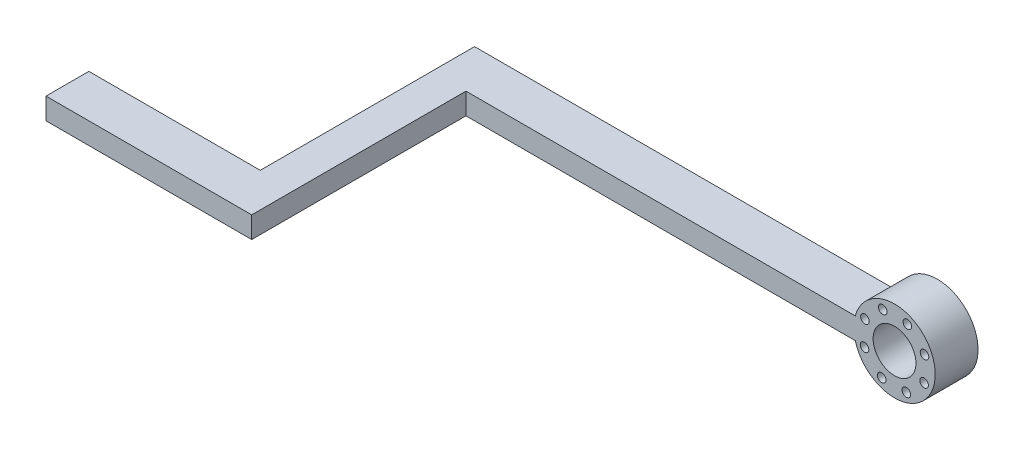
ISO-10303-21;
HEADER;
FILE_DESCRIPTION(('STEP AP214'),'2;1');
FILE_NAME('part.step','',(''),(''),'','','');
FILE_SCHEMA(('AUTOMOTIVE_DESIGN { 1 0 10303 214 1 1 1 1 }'));
ENDSEC;
DATA;
#1=APPLICATION_CONTEXT('core data for automotive mechanical design processes');
#2=APPLICATION_PROTOCOL_DEFINITION('international standard','automotive_design',2000,#1);
#3=PRODUCT_CONTEXT('',#1,'mechanical');
#4=PRODUCT('Part','Part','',(#3));
#5=PRODUCT_RELATED_PRODUCT_CATEGORY('part','',(#4));
#6=PRODUCT_DEFINITION_FORMATION('','',#4);
#7=PRODUCT_DEFINITION_CONTEXT('part definition',#1,'design');
#8=PRODUCT_DEFINITION('design','',#6,#7);
#9=PRODUCT_DEFINITION_SHAPE('','',#8);
#10=(LENGTH_UNIT() NAMED_UNIT(*) SI_UNIT(.MILLI.,.METRE.));
#11=(NAMED_UNIT(*) PLANE_ANGLE_UNIT() SI_UNIT($,.RADIAN.));
#12=(NAMED_UNIT(*) SI_UNIT($,.STERADIAN.) SOLID_ANGLE_UNIT());
#13=UNCERTAINTY_MEASURE_WITH_UNIT(LENGTH_MEASURE(1.E-05),#10,'distance_accuracy_value','');
#14=(GEOMETRIC_REPRESENTATION_CONTEXT(3) GLOBAL_UNCERTAINTY_ASSIGNED_CONTEXT((#13)) GLOBAL_UNIT_ASSIGNED_CONTEXT((#10,
#11,#12)) REPRESENTATION_CONTEXT('',''));
#15=CARTESIAN_POINT('',(0.,0.,0.));
#16=DIRECTION('',(0.,0.,1.));
#17=DIRECTION('',(1.,0.,0.));
#18=AXIS2_PLACEMENT_3D('',#15,#16,#17);
#19=CARTESIAN_POINT('',(0.,0.,10.));
#20=DIRECTION('',(0.,0.,1.));
#21=DIRECTION('',(1.,0.,0.));
#22=AXIS2_PLACEMENT_3D('',#19,#20,#21);
#23=PLANE('',#22);
#24=CARTESIAN_POINT('',(7.,2.75536288708622,10.));
#25=DIRECTION('',(0.,0.,1.));
#26=DIRECTION('',(1.,0.,0.));
#27=AXIS2_PLACEMENT_3D('',#24,#25,#26);
#28=CIRCLE('',#27,1.);
#29=CARTESIAN_POINT('',(8.,2.75536288708622,10.));
#30=VERTEX_POINT('',#29);
#31=EDGE_CURVE('E141',#30,#30,#28,.T.);
#32=ORIENTED_EDGE('',*,*,#31,.F.);
#33=EDGE_LOOP('',(#32));
#34=FACE_BOUND('',#33,.T.);
#35=CARTESIAN_POINT('',(-2.75536288708622,7.,10.));
#36=DIRECTION('',(0.,0.,1.));
#37=DIRECTION('',(1.,0.,0.));
#38=AXIS2_PLACEMENT_3D('',#35,#36,#37);
#39=CIRCLE('',#38,1.);
#40=CARTESIAN_POINT('',(-1.75536288708622,7.,10.));
#41=VERTEX_POINT('',#40);
#42=EDGE_CURVE('E129',#41,#41,#39,.T.);
#43=ORIENTED_EDGE('',*,*,#42,.F.);
#44=EDGE_LOOP('',(#43));
#45=FACE_BOUND('',#44,.T.);
#46=CARTESIAN_POINT('',(-7.,-2.75536288708622,10.));
#47=DIRECTION('',(0.,0.,1.));
#48=DIRECTION('',(1.,0.,0.));
#49=AXIS2_PLACEMENT_3D('',#46,#47,#48);
#50=CIRCLE('',#49,1.);
#51=CARTESIAN_POINT('',(-6.,-2.75536288708622,10.));
#52=VERTEX_POINT('',#51);
#53=EDGE_CURVE('E117',#52,#52,#50,.T.);
#54=ORIENTED_EDGE('',*,*,#53,.F.);
#55=EDGE_LOOP('',(#54));
#56=FACE_BOUND('',#55,.T.);
#57=CARTESIAN_POINT('',(2.75536288708622,-7.,10.));
#58=DIRECTION('',(0.,0.,1.));
#59=DIRECTION('',(1.,0.,0.));
#60=AXIS2_PLACEMENT_3D('',#57,#58,#59);
#61=CIRCLE('',#60,1.);
#62=CARTESIAN_POINT('',(3.75536288708622,-7.,10.));
#63=VERTEX_POINT('',#62);
#64=EDGE_CURVE('E106',#63,#63,#61,.T.);
#65=ORIENTED_EDGE('',*,*,#64,.F.);
#66=EDGE_LOOP('',(#65));
#67=FACE_BOUND('',#66,.T.);
#68=CARTESIAN_POINT('',(0.,0.,10.));
#69=DIRECTION('',(0.,0.,1.));
#70=DIRECTION('',(1.,0.,0.));
#71=AXIS2_PLACEMENT_3D('',#68,#69,#70);
#72=CIRCLE('',#71,9.5);
#73=CARTESIAN_POINT('',(-9.16515138991168,-2.5,10.));
#74=VERTEX_POINT('',#73);
#75=CARTESIAN_POINT('',(-9.16515138991168,2.5,10.));
#76=VERTEX_POINT('',#75);
#77=EDGE_CURVE('E85',#74,#76,#72,.T.);
#78=ORIENTED_EDGE('',*,*,#77,.T.);
#79=DIRECTION('',(-1.,0.,0.));
#80=VECTOR('',#79,1.);
#81=CARTESIAN_POINT('',(-9.16515138991168,2.5,10.));
#82=LINE('',#81,#80);
#83=CARTESIAN_POINT('',(-100.,2.5,10.));
#84=VERTEX_POINT('',#83);
#85=EDGE_CURVE('E79',#76,#84,#82,.T.);
#86=ORIENTED_EDGE('',*,*,#85,.T.);
#87=DIRECTION('',(0.,-1.,0.));
#88=VECTOR('',#87,1.);
#89=CARTESIAN_POINT('',(-100.,2.5,10.));
#90=LINE('',#89,#88);
#91=CARTESIAN_POINT('',(-100.,-2.5,10.));
#92=VERTEX_POINT('',#91);
#93=EDGE_CURVE('E70',#84,#92,#90,.T.);
#94=ORIENTED_EDGE('',*,*,#93,.T.);
#95=DIRECTION('',(1.,0.,0.));
#96=VECTOR('',#95,1.);
#97=CARTESIAN_POINT('',(-100.,-2.5,10.));
#98=LINE('',#97,#96);
#99=EDGE_CURVE('E50',#92,#74,#98,.T.);
#100=ORIENTED_EDGE('',*,*,#99,.T.);
#101=EDGE_LOOP('',(#78,#86,#94,#100));
#102=FACE_BOUND('',#101,.T.);
#103=CARTESIAN_POINT('',(0.,0.,10.));
#104=DIRECTION('',(0.,0.,1.));
#105=DIRECTION('',(1.,0.,0.));
#106=AXIS2_PLACEMENT_3D('',#103,#104,#105);
#107=CIRCLE('',#106,5.);
#108=CARTESIAN_POINT('',(5.,0.,10.));
#109=VERTEX_POINT('',#108);
#110=EDGE_CURVE('E95',#109,#109,#107,.T.);
#111=ORIENTED_EDGE('',*,*,#110,.F.);
#112=EDGE_LOOP('',(#111));
#113=FACE_BOUND('',#112,.T.);
#114=CARTESIAN_POINT('',(-3.00141168621742,-6.89808325039424,10.));
#115=DIRECTION('',(0.,0.,1.));
#116=DIRECTION('',(1.,0.,0.));
#117=AXIS2_PLACEMENT_3D('',#114,#115,#116);
#118=CIRCLE('',#117,1.);
#119=CARTESIAN_POINT('',(-2.00141168621742,-6.89808325039424,10.));
#120=VERTEX_POINT('',#119);
#121=EDGE_CURVE('E111',#120,#120,#118,.T.);
#122=ORIENTED_EDGE('',*,*,#121,.F.);
#123=EDGE_LOOP('',(#122));
#124=FACE_BOUND('',#123,.T.);
#125=CARTESIAN_POINT('',(-6.89808325039424,3.00141168621742,10.));
#126=DIRECTION('',(0.,0.,1.));
#127=DIRECTION('',(1.,0.,0.));
#128=AXIS2_PLACEMENT_3D('',#125,#126,#127);
#129=CIRCLE('',#128,1.);
#130=CARTESIAN_POINT('',(-5.89808325039424,3.00141168621742,10.));
#131=VERTEX_POINT('',#130);
#132=EDGE_CURVE('E123',#131,#131,#129,.T.);
#133=ORIENTED_EDGE('',*,*,#132,.F.);
#134=EDGE_LOOP('',(#133));
#135=FACE_BOUND('',#134,.T.);
#136=CARTESIAN_POINT('',(3.00141168621742,6.89808325039425,10.));
#137=DIRECTION('',(0.,0.,1.));
#138=DIRECTION('',(1.,0.,0.));
#139=AXIS2_PLACEMENT_3D('',#136,#137,#138);
#140=CIRCLE('',#139,0.999999999999999);
#141=CARTESIAN_POINT('',(4.00141168621742,6.89808325039425,10.));
#142=VERTEX_POINT('',#141);
#143=EDGE_CURVE('E135',#142,#142,#140,.T.);
#144=ORIENTED_EDGE('',*,*,#143,.F.);
#145=EDGE_LOOP('',(#144));
#146=FACE_BOUND('',#145,.T.);
#147=CARTESIAN_POINT('',(6.89808325039425,-3.00141168621742,10.));
#148=DIRECTION('',(0.,0.,1.));
#149=DIRECTION('',(1.,0.,0.));
#150=AXIS2_PLACEMENT_3D('',#147,#148,#149);
#151=CIRCLE('',#150,1.);
#152=CARTESIAN_POINT('',(7.89808325039425,-3.00141168621742,10.));
#153=VERTEX_POINT('',#152);
#154=EDGE_CURVE('E147',#153,#153,#151,.T.);
#155=ORIENTED_EDGE('',*,*,#154,.F.);
#156=EDGE_LOOP('',(#155));
#157=FACE_BOUND('',#156,.T.);
#158=ADVANCED_FACE('F33',(#34,#45,#56,#67,#102,#113,#124,#135,#146,#157),#23,.T.);
#159=CARTESIAN_POINT('',(0.,0.,0.));
#160=DIRECTION('',(0.,0.,1.));
#161=DIRECTION('',(1.,0.,0.));
#162=AXIS2_PLACEMENT_3D('',#159,#160,#161);
#163=PLANE('',#162);
#164=CARTESIAN_POINT('',(0.,0.,0.));
#165=DIRECTION('',(0.,0.,1.));
#166=DIRECTION('',(1.,0.,0.));
#167=AXIS2_PLACEMENT_3D('',#164,#165,#166);
#168=CIRCLE('',#167,9.5);
#169=CARTESIAN_POINT('',(-9.16515138991168,-2.5,0.));
#170=VERTEX_POINT('',#169);
#171=CARTESIAN_POINT('',(-9.16515138991168,2.5,0.));
#172=VERTEX_POINT('',#171);
#173=EDGE_CURVE('E93',#170,#172,#168,.T.);
#174=ORIENTED_EDGE('',*,*,#173,.F.);
#175=DIRECTION('',(1.,0.,0.));
#176=VECTOR('',#175,1.);
#177=CARTESIAN_POINT('',(-100.,-2.5,0.));
#178=LINE('',#177,#176);
#179=CARTESIAN_POINT('',(-108.,-2.5,0.));
#180=VERTEX_POINT('',#179);
#181=EDGE_CURVE('E91',#180,#170,#178,.T.);
#182=ORIENTED_EDGE('',*,*,#181,.F.);
#183=DIRECTION('',(0.,1.,0.));
#184=VECTOR('',#183,1.);
#185=CARTESIAN_POINT('',(-108.,2.5,0.));
#186=LINE('',#185,#184);
#187=CARTESIAN_POINT('',(-108.,2.5,0.));
#188=VERTEX_POINT('',#187);
#189=EDGE_CURVE('E167',#180,#188,#186,.T.);
#190=ORIENTED_EDGE('',*,*,#189,.T.);
#191=DIRECTION('',(-1.,0.,0.));
#192=VECTOR('',#191,1.);
#193=CARTESIAN_POINT('',(-9.16515138991168,2.5,0.));
#194=LINE('',#193,#192);
#195=EDGE_CURVE('E63',#172,#188,#194,.T.);
#196=ORIENTED_EDGE('',*,*,#195,.F.);
#197=EDGE_LOOP('',(#174,#182,#190,#196));
#198=FACE_BOUND('',#197,.T.);
#199=CARTESIAN_POINT('',(0.,0.,0.));
#200=DIRECTION('',(0.,0.,1.));
#201=DIRECTION('',(1.,0.,0.));
#202=AXIS2_PLACEMENT_3D('',#199,#200,#201);
#203=CIRCLE('',#202,5.);
#204=CARTESIAN_POINT('',(5.,0.,0.));
#205=VERTEX_POINT('',#204);
#206=EDGE_CURVE('E99',#205,#205,#203,.T.);
#207=ORIENTED_EDGE('',*,*,#206,.T.);
#208=EDGE_LOOP('',(#207));
#209=FACE_BOUND('',#208,.T.);
#210=CARTESIAN_POINT('',(2.75536288708622,-7.,0.));
#211=DIRECTION('',(0.,0.,1.));
#212=DIRECTION('',(1.,0.,0.));
#213=AXIS2_PLACEMENT_3D('',#210,#211,#212);
#214=CIRCLE('',#213,1.);
#215=CARTESIAN_POINT('',(3.75536288708622,-7.,0.));
#216=VERTEX_POINT('',#215);
#217=EDGE_CURVE('E108',#216,#216,#214,.T.);
#218=ORIENTED_EDGE('',*,*,#217,.T.);
#219=EDGE_LOOP('',(#218));
#220=FACE_BOUND('',#219,.T.);
#221=CARTESIAN_POINT('',(-3.00141168621742,-6.89808325039424,0.));
#222=DIRECTION('',(0.,0.,1.));
#223=DIRECTION('',(1.,0.,0.));
#224=AXIS2_PLACEMENT_3D('',#221,#222,#223);
#225=CIRCLE('',#224,1.);
#226=CARTESIAN_POINT('',(-2.00141168621742,-6.89808325039424,0.));
#227=VERTEX_POINT('',#226);
#228=EDGE_CURVE('E114',#227,#227,#225,.T.);
#229=ORIENTED_EDGE('',*,*,#228,.T.);
#230=EDGE_LOOP('',(#229));
#231=FACE_BOUND('',#230,.T.);
#232=CARTESIAN_POINT('',(-7.,-2.75536288708622,0.));
#233=DIRECTION('',(0.,0.,1.));
#234=DIRECTION('',(1.,0.,0.));
#235=AXIS2_PLACEMENT_3D('',#232,#233,#234);
#236=CIRCLE('',#235,1.);
#237=CARTESIAN_POINT('',(-6.,-2.75536288708622,0.));
#238=VERTEX_POINT('',#237);
#239=EDGE_CURVE('E120',#238,#238,#236,.T.);
#240=ORIENTED_EDGE('',*,*,#239,.T.);
#241=EDGE_LOOP('',(#240));
#242=FACE_BOUND('',#241,.T.);
#243=CARTESIAN_POINT('',(-6.89808325039424,3.00141168621742,0.));
#244=DIRECTION('',(0.,0.,1.));
#245=DIRECTION('',(1.,0.,0.));
#246=AXIS2_PLACEMENT_3D('',#243,#244,#245);
#247=CIRCLE('',#246,1.);
#248=CARTESIAN_POINT('',(-5.89808325039424,3.00141168621742,0.));
#249=VERTEX_POINT('',#248);
#250=EDGE_CURVE('E126',#249,#249,#247,.T.);
#251=ORIENTED_EDGE('',*,*,#250,.T.);
#252=EDGE_LOOP('',(#251));
#253=FACE_BOUND('',#252,.T.);
#254=CARTESIAN_POINT('',(-2.75536288708622,7.,0.));
#255=DIRECTION('',(0.,0.,1.));
#256=DIRECTION('',(1.,0.,0.));
#257=AXIS2_PLACEMENT_3D('',#254,#255,#256);
#258=CIRCLE('',#257,1.);
#259=CARTESIAN_POINT('',(-1.75536288708622,7.,0.));
#260=VERTEX_POINT('',#259);
#261=EDGE_CURVE('E132',#260,#260,#258,.T.);
#262=ORIENTED_EDGE('',*,*,#261,.T.);
#263=EDGE_LOOP('',(#262));
#264=FACE_BOUND('',#263,.T.);
#265=CARTESIAN_POINT('',(3.00141168621742,6.89808325039425,0.));
#266=DIRECTION('',(0.,0.,1.));
#267=DIRECTION('',(1.,0.,0.));
#268=AXIS2_PLACEMENT_3D('',#265,#266,#267);
#269=CIRCLE('',#268,0.999999999999999);
#270=CARTESIAN_POINT('',(4.00141168621742,6.89808325039425,0.));
#271=VERTEX_POINT('',#270);
#272=EDGE_CURVE('E138',#271,#271,#269,.T.);
#273=ORIENTED_EDGE('',*,*,#272,.T.);
#274=EDGE_LOOP('',(#273));
#275=FACE_BOUND('',#274,.T.);
#276=CARTESIAN_POINT('',(7.,2.75536288708622,0.));
#277=DIRECTION('',(0.,0.,1.));
#278=DIRECTION('',(1.,0.,0.));
#279=AXIS2_PLACEMENT_3D('',#276,#277,#278);
#280=CIRCLE('',#279,1.);
#281=CARTESIAN_POINT('',(8.,2.75536288708622,0.));
#282=VERTEX_POINT('',#281);
#283=EDGE_CURVE('E144',#282,#282,#280,.T.);
#284=ORIENTED_EDGE('',*,*,#283,.T.);
#285=EDGE_LOOP('',(#284));
#286=FACE_BOUND('',#285,.T.);
#287=CARTESIAN_POINT('',(6.89808325039425,-3.00141168621742,0.));
#288=DIRECTION('',(0.,0.,1.));
#289=DIRECTION('',(1.,0.,0.));
#290=AXIS2_PLACEMENT_3D('',#287,#288,#289);
#291=CIRCLE('',#290,1.);
#292=CARTESIAN_POINT('',(7.89808325039425,-3.00141168621742,0.));
#293=VERTEX_POINT('',#292);
#294=EDGE_CURVE('E150',#293,#293,#291,.T.);
#295=ORIENTED_EDGE('',*,*,#294,.T.);
#296=EDGE_LOOP('',(#295));
#297=FACE_BOUND('',#296,.T.);
#298=ADVANCED_FACE('F221',(#198,#209,#220,#231,#242,#253,#264,#275,#286,#297),#163,.F.);
#299=CARTESIAN_POINT('',(0.,0.,10.));
#300=DIRECTION('',(0.,0.,-1.));
#301=DIRECTION('',(-1.,0.,0.));
#302=AXIS2_PLACEMENT_3D('',#299,#300,#301);
#303=CYLINDRICAL_SURFACE('',#302,9.5);
#304=ORIENTED_EDGE('',*,*,#173,.T.);
#305=DIRECTION('',(0.,0.,-1.));
#306=VECTOR('',#305,1.);
#307=CARTESIAN_POINT('',(-9.16515138991168,2.5,10.));
#308=LINE('',#307,#306);
#309=EDGE_CURVE('E11',#76,#172,#308,.T.);
#310=ORIENTED_EDGE('',*,*,#309,.F.);
#311=ORIENTED_EDGE('',*,*,#77,.F.);
#312=DIRECTION('',(0.,0.,-1.));
#313=VECTOR('',#312,1.);
#314=CARTESIAN_POINT('',(-9.16515138991168,-2.5,10.));
#315=LINE('',#314,#313);
#316=EDGE_CURVE('E42',#74,#170,#315,.T.);
#317=ORIENTED_EDGE('',*,*,#316,.T.);
#318=EDGE_LOOP('',(#304,#310,#311,#317));
#319=FACE_BOUND('',#318,.T.);
#320=ADVANCED_FACE('F35',(#319),#303,.T.);
#321=CARTESIAN_POINT('',(-9.16515138991168,2.5,10.));
#322=DIRECTION('',(0.,-1.,0.));
#323=DIRECTION('',(0.,0.,-1.));
#324=AXIS2_PLACEMENT_3D('',#321,#322,#323);
#325=PLANE('',#324);
#326=ORIENTED_EDGE('',*,*,#195,.T.);
#327=DIRECTION('',(0.,0.,-1.));
#328=VECTOR('',#327,1.);
#329=CARTESIAN_POINT('',(-108.,2.5,50.));
#330=LINE('',#329,#328);
#331=CARTESIAN_POINT('',(-108.,2.5,50.));
#332=VERTEX_POINT('',#331);
#333=EDGE_CURVE('E156',#332,#188,#330,.T.);
#334=ORIENTED_EDGE('',*,*,#333,.F.);
#335=DIRECTION('',(1.,0.,0.));
#336=VECTOR('',#335,1.);
#337=CARTESIAN_POINT('',(-148.,2.5,50.));
#338=LINE('',#337,#336);
#339=CARTESIAN_POINT('',(-148.,2.5,50.));
#340=VERTEX_POINT('',#339);
#341=EDGE_CURVE('E177',#340,#332,#338,.T.);
#342=ORIENTED_EDGE('',*,*,#341,.F.);
#343=DIRECTION('',(0.,0.,-1.));
#344=VECTOR('',#343,1.);
#345=CARTESIAN_POINT('',(-148.,2.5,50.));
#346=LINE('',#345,#344);
#347=CARTESIAN_POINT('',(-148.,2.5,60.));
#348=VERTEX_POINT('',#347);
#349=EDGE_CURVE('E180',#348,#340,#346,.T.);
#350=ORIENTED_EDGE('',*,*,#349,.F.);
#351=DIRECTION('',(1.,0.,0.));
#352=VECTOR('',#351,1.);
#353=CARTESIAN_POINT('',(-148.,2.5,60.));
#354=LINE('',#353,#352);
#355=CARTESIAN_POINT('',(-100.,2.5,60.));
#356=VERTEX_POINT('',#355);
#357=EDGE_CURVE('E175',#348,#356,#354,.T.);
#358=ORIENTED_EDGE('',*,*,#357,.T.);
#359=DIRECTION('',(0.,0.,-1.));
#360=VECTOR('',#359,1.);
#361=CARTESIAN_POINT('',(-100.,2.5,50.));
#362=LINE('',#361,#360);
#363=EDGE_CURVE('E84',#356,#84,#362,.T.);
#364=ORIENTED_EDGE('',*,*,#363,.T.);
#365=ORIENTED_EDGE('',*,*,#85,.F.);
#366=ORIENTED_EDGE('',*,*,#309,.T.);
#367=EDGE_LOOP('',(#326,#334,#342,#350,#358,#364,#365,#366));
#368=FACE_BOUND('',#367,.T.);
#369=ADVANCED_FACE('F80',(#368),#325,.F.);
#370=CARTESIAN_POINT('',(-100.,-2.5,10.));
#371=DIRECTION('',(0.,1.,0.));
#372=DIRECTION('',(0.,0.,1.));
#373=AXIS2_PLACEMENT_3D('',#370,#371,#372);
#374=PLANE('',#373);
#375=ORIENTED_EDGE('',*,*,#181,.T.);
#376=ORIENTED_EDGE('',*,*,#316,.F.);
#377=ORIENTED_EDGE('',*,*,#99,.F.);
#378=DIRECTION('',(0.,0.,-1.));
#379=VECTOR('',#378,1.);
#380=CARTESIAN_POINT('',(-100.,-2.5,50.));
#381=LINE('',#380,#379);
#382=CARTESIAN_POINT('',(-100.,-2.5,60.));
#383=VERTEX_POINT('',#382);
#384=EDGE_CURVE('E162',#383,#92,#381,.T.);
#385=ORIENTED_EDGE('',*,*,#384,.F.);
#386=DIRECTION('',(1.,0.,0.));
#387=VECTOR('',#386,1.);
#388=CARTESIAN_POINT('',(-148.,-2.5,60.));
#389=LINE('',#388,#387);
#390=CARTESIAN_POINT('',(-148.,-2.5,60.));
#391=VERTEX_POINT('',#390);
#392=EDGE_CURVE('E172',#391,#383,#389,.T.);
#393=ORIENTED_EDGE('',*,*,#392,.F.);
#394=DIRECTION('',(0.,0.,1.));
#395=VECTOR('',#394,1.);
#396=CARTESIAN_POINT('',(-148.,-2.5,50.));
#397=LINE('',#396,#395);
#398=CARTESIAN_POINT('',(-148.,-2.5,50.));
#399=VERTEX_POINT('',#398);
#400=EDGE_CURVE('E186',#399,#391,#397,.T.);
#401=ORIENTED_EDGE('',*,*,#400,.F.);
#402=DIRECTION('',(1.,0.,0.));
#403=VECTOR('',#402,1.);
#404=CARTESIAN_POINT('',(-148.,-2.5,50.));
#405=LINE('',#404,#403);
#406=CARTESIAN_POINT('',(-108.,-2.5,50.));
#407=VERTEX_POINT('',#406);
#408=EDGE_CURVE('E169',#399,#407,#405,.T.);
#409=ORIENTED_EDGE('',*,*,#408,.T.);
#410=DIRECTION('',(0.,0.,-1.));
#411=VECTOR('',#410,1.);
#412=CARTESIAN_POINT('',(-108.,-2.5,50.));
#413=LINE('',#412,#411);
#414=EDGE_CURVE('E159',#407,#180,#413,.T.);
#415=ORIENTED_EDGE('',*,*,#414,.T.);
#416=EDGE_LOOP('',(#375,#376,#377,#385,#393,#401,#409,#415));
#417=FACE_BOUND('',#416,.T.);
#418=ADVANCED_FACE('F225',(#417),#374,.F.);
#419=CARTESIAN_POINT('',(0.,0.,10.));
#420=DIRECTION('',(0.,0.,-1.));
#421=DIRECTION('',(-1.,0.,0.));
#422=AXIS2_PLACEMENT_3D('',#419,#420,#421);
#423=CYLINDRICAL_SURFACE('',#422,5.);
#424=ORIENTED_EDGE('',*,*,#110,.T.);
#425=EDGE_LOOP('',(#424));
#426=FACE_BOUND('',#425,.T.);
#427=ORIENTED_EDGE('',*,*,#206,.F.);
#428=EDGE_LOOP('',(#427));
#429=FACE_BOUND('',#428,.T.);
#430=ADVANCED_FACE('F252',(#426,#429),#423,.F.);
#431=CARTESIAN_POINT('',(2.75536288708622,-7.,10.));
#432=DIRECTION('',(0.,0.,-1.));
#433=DIRECTION('',(-1.,0.,0.));
#434=AXIS2_PLACEMENT_3D('',#431,#432,#433);
#435=CYLINDRICAL_SURFACE('',#434,1.);
#436=ORIENTED_EDGE('',*,*,#64,.T.);
#437=EDGE_LOOP('',(#436));
#438=FACE_BOUND('',#437,.T.);
#439=ORIENTED_EDGE('',*,*,#217,.F.);
#440=EDGE_LOOP('',(#439));
#441=FACE_BOUND('',#440,.T.);
#442=ADVANCED_FACE('F351',(#438,#441),#435,.F.);
#443=CARTESIAN_POINT('',(-3.00141168621742,-6.89808325039424,10.));
#444=DIRECTION('',(0.,0.,-1.));
#445=DIRECTION('',(-1.,0.,0.));
#446=AXIS2_PLACEMENT_3D('',#443,#444,#445);
#447=CYLINDRICAL_SURFACE('',#446,1.);
#448=ORIENTED_EDGE('',*,*,#121,.T.);
#449=EDGE_LOOP('',(#448));
#450=FACE_BOUND('',#449,.T.);
#451=ORIENTED_EDGE('',*,*,#228,.F.);
#452=EDGE_LOOP('',(#451));
#453=FACE_BOUND('',#452,.T.);
#454=ADVANCED_FACE('F348',(#450,#453),#447,.F.);
#455=CARTESIAN_POINT('',(-7.,-2.75536288708622,10.));
#456=DIRECTION('',(0.,0.,-1.));
#457=DIRECTION('',(-1.,0.,0.));
#458=AXIS2_PLACEMENT_3D('',#455,#456,#457);
#459=CYLINDRICAL_SURFACE('',#458,1.);
#460=ORIENTED_EDGE('',*,*,#53,.T.);
#461=EDGE_LOOP('',(#460));
#462=FACE_BOUND('',#461,.T.);
#463=ORIENTED_EDGE('',*,*,#239,.F.);
#464=EDGE_LOOP('',(#463));
#465=FACE_BOUND('',#464,.T.);
#466=ADVANCED_FACE('F344',(#462,#465),#459,.F.);
#467=CARTESIAN_POINT('',(-6.89808325039424,3.00141168621742,10.));
#468=DIRECTION('',(0.,0.,-1.));
#469=DIRECTION('',(-1.,0.,0.));
#470=AXIS2_PLACEMENT_3D('',#467,#468,#469);
#471=CYLINDRICAL_SURFACE('',#470,1.);
#472=ORIENTED_EDGE('',*,*,#132,.T.);
#473=EDGE_LOOP('',(#472));
#474=FACE_BOUND('',#473,.T.);
#475=ORIENTED_EDGE('',*,*,#250,.F.);
#476=EDGE_LOOP('',(#475));
#477=FACE_BOUND('',#476,.T.);
#478=ADVANCED_FACE('F340',(#474,#477),#471,.F.);
#479=CARTESIAN_POINT('',(-2.75536288708622,7.,10.));
#480=DIRECTION('',(0.,0.,-1.));
#481=DIRECTION('',(-1.,0.,0.));
#482=AXIS2_PLACEMENT_3D('',#479,#480,#481);
#483=CYLINDRICAL_SURFACE('',#482,1.);
#484=ORIENTED_EDGE('',*,*,#42,.T.);
#485=EDGE_LOOP('',(#484));
#486=FACE_BOUND('',#485,.T.);
#487=ORIENTED_EDGE('',*,*,#261,.F.);
#488=EDGE_LOOP('',(#487));
#489=FACE_BOUND('',#488,.T.);
#490=ADVANCED_FACE('F336',(#486,#489),#483,.F.);
#491=CARTESIAN_POINT('',(3.00141168621742,6.89808325039425,10.));
#492=DIRECTION('',(0.,0.,-1.));
#493=DIRECTION('',(-1.,0.,0.));
#494=AXIS2_PLACEMENT_3D('',#491,#492,#493);
#495=CYLINDRICAL_SURFACE('',#494,0.999999999999999);
#496=ORIENTED_EDGE('',*,*,#143,.T.);
#497=EDGE_LOOP('',(#496));
#498=FACE_BOUND('',#497,.T.);
#499=ORIENTED_EDGE('',*,*,#272,.F.);
#500=EDGE_LOOP('',(#499));
#501=FACE_BOUND('',#500,.T.);
#502=ADVANCED_FACE('F332',(#498,#501),#495,.F.);
#503=CARTESIAN_POINT('',(7.,2.75536288708622,10.));
#504=DIRECTION('',(0.,0.,-1.));
#505=DIRECTION('',(-1.,0.,0.));
#506=AXIS2_PLACEMENT_3D('',#503,#504,#505);
#507=CYLINDRICAL_SURFACE('',#506,1.);
#508=ORIENTED_EDGE('',*,*,#31,.T.);
#509=EDGE_LOOP('',(#508));
#510=FACE_BOUND('',#509,.T.);
#511=ORIENTED_EDGE('',*,*,#283,.F.);
#512=EDGE_LOOP('',(#511));
#513=FACE_BOUND('',#512,.T.);
#514=ADVANCED_FACE('F328',(#510,#513),#507,.F.);
#515=CARTESIAN_POINT('',(6.89808325039425,-3.00141168621742,10.));
#516=DIRECTION('',(0.,0.,-1.));
#517=DIRECTION('',(-1.,0.,0.));
#518=AXIS2_PLACEMENT_3D('',#515,#516,#517);
#519=CYLINDRICAL_SURFACE('',#518,1.);
#520=ORIENTED_EDGE('',*,*,#154,.T.);
#521=EDGE_LOOP('',(#520));
#522=FACE_BOUND('',#521,.T.);
#523=ORIENTED_EDGE('',*,*,#294,.F.);
#524=EDGE_LOOP('',(#523));
#525=FACE_BOUND('',#524,.T.);
#526=ADVANCED_FACE('F295',(#522,#525),#519,.F.);
#527=CARTESIAN_POINT('',(-100.,2.5,50.));
#528=DIRECTION('',(-1.,0.,0.));
#529=DIRECTION('',(0.,0.,1.));
#530=AXIS2_PLACEMENT_3D('',#527,#528,#529);
#531=PLANE('',#530);
#532=ORIENTED_EDGE('',*,*,#93,.F.);
#533=ORIENTED_EDGE('',*,*,#363,.F.);
#534=DIRECTION('',(0.,-1.,0.));
#535=VECTOR('',#534,1.);
#536=CARTESIAN_POINT('',(-100.,-2.5,60.));
#537=LINE('',#536,#535);
#538=EDGE_CURVE('E192',#356,#383,#537,.T.);
#539=ORIENTED_EDGE('',*,*,#538,.T.);
#540=ORIENTED_EDGE('',*,*,#384,.T.);
#541=EDGE_LOOP('',(#532,#533,#539,#540));
#542=FACE_BOUND('',#541,.T.);
#543=ADVANCED_FACE('F196',(#542),#531,.F.);
#544=CARTESIAN_POINT('',(-108.,2.5,50.));
#545=DIRECTION('',(1.,0.,0.));
#546=DIRECTION('',(0.,0.,-1.));
#547=AXIS2_PLACEMENT_3D('',#544,#545,#546);
#548=PLANE('',#547);
#549=ORIENTED_EDGE('',*,*,#333,.T.);
#550=ORIENTED_EDGE('',*,*,#189,.F.);
#551=ORIENTED_EDGE('',*,*,#414,.F.);
#552=DIRECTION('',(0.,-1.,0.));
#553=VECTOR('',#552,1.);
#554=CARTESIAN_POINT('',(-108.,2.5,50.));
#555=LINE('',#554,#553);
#556=EDGE_CURVE('E164',#332,#407,#555,.T.);
#557=ORIENTED_EDGE('',*,*,#556,.F.);
#558=EDGE_LOOP('',(#549,#550,#551,#557));
#559=FACE_BOUND('',#558,.T.);
#560=ADVANCED_FACE('F229',(#559),#548,.F.);
#561=CARTESIAN_POINT('',(-148.,-2.5,50.));
#562=DIRECTION('',(0.,0.,1.));
#563=DIRECTION('',(1.,0.,0.));
#564=AXIS2_PLACEMENT_3D('',#561,#562,#563);
#565=PLANE('',#564);
#566=ORIENTED_EDGE('',*,*,#341,.T.);
#567=ORIENTED_EDGE('',*,*,#556,.T.);
#568=ORIENTED_EDGE('',*,*,#408,.F.);
#569=DIRECTION('',(0.,-1.,0.));
#570=VECTOR('',#569,1.);
#571=CARTESIAN_POINT('',(-148.,-2.5,50.));
#572=LINE('',#571,#570);
#573=EDGE_CURVE('E189',#340,#399,#572,.T.);
#574=ORIENTED_EDGE('',*,*,#573,.F.);
#575=EDGE_LOOP('',(#566,#567,#568,#574));
#576=FACE_BOUND('',#575,.T.);
#577=ADVANCED_FACE('F233',(#576),#565,.F.);
#578=CARTESIAN_POINT('',(-148.,-2.5,60.));
#579=DIRECTION('',(0.,0.,-1.));
#580=DIRECTION('',(-1.,0.,0.));
#581=AXIS2_PLACEMENT_3D('',#578,#579,#580);
#582=PLANE('',#581);
#583=ORIENTED_EDGE('',*,*,#392,.T.);
#584=ORIENTED_EDGE('',*,*,#538,.F.);
#585=ORIENTED_EDGE('',*,*,#357,.F.);
#586=DIRECTION('',(0.,1.,0.));
#587=VECTOR('',#586,1.);
#588=CARTESIAN_POINT('',(-148.,-2.5,60.));
#589=LINE('',#588,#587);
#590=EDGE_CURVE('E183',#391,#348,#589,.T.);
#591=ORIENTED_EDGE('',*,*,#590,.F.);
#592=EDGE_LOOP('',(#583,#584,#585,#591));
#593=FACE_BOUND('',#592,.T.);
#594=ADVANCED_FACE('F202',(#593),#582,.F.);
#595=CARTESIAN_POINT('',(-148.,0.,0.));
#596=DIRECTION('',(1.,0.,0.));
#597=DIRECTION('',(0.,0.,-1.));
#598=AXIS2_PLACEMENT_3D('',#595,#596,#597);
#599=PLANE('',#598);
#600=ORIENTED_EDGE('',*,*,#573,.T.);
#601=ORIENTED_EDGE('',*,*,#400,.T.);
#602=ORIENTED_EDGE('',*,*,#590,.T.);
#603=ORIENTED_EDGE('',*,*,#349,.T.);
#604=EDGE_LOOP('',(#600,#601,#602,#603));
#605=FACE_BOUND('',#604,.T.);
#606=ADVANCED_FACE('F235',(#605),#599,.F.);
#607=CLOSED_SHELL('',(#158,#298,#320,#369,#418,#430,#442,#454,#466,#478,#490,#502,#514,#526,
#543,#560,#577,#594,#606));
#608=MANIFOLD_SOLID_BREP('B2',#607);
#609=ADVANCED_BREP_SHAPE_REPRESENTATION('',(#18,#608),#14);
#610=SHAPE_DEFINITION_REPRESENTATION(#9,#609);
ENDSEC;
END-ISO-10303-21;
